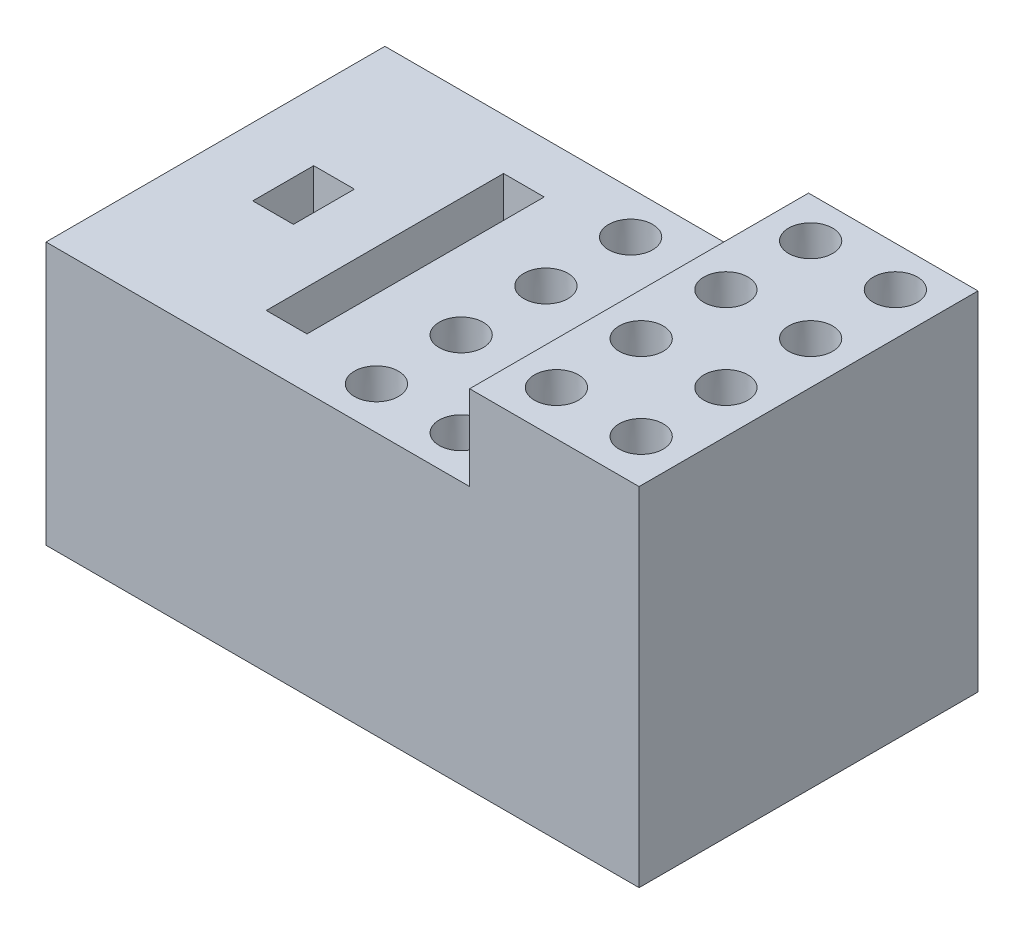
ISO-10303-21;
HEADER;
FILE_DESCRIPTION(('STEP AP214'),'2;1');
FILE_NAME('part.step','',(''),(''),'','','');
FILE_SCHEMA(('AUTOMOTIVE_DESIGN { 1 0 10303 214 1 1 1 1 }'));
ENDSEC;
DATA;
#1=APPLICATION_CONTEXT('core data for automotive mechanical design processes');
#2=APPLICATION_PROTOCOL_DEFINITION('international standard','automotive_design',2000,#1);
#3=PRODUCT_CONTEXT('',#1,'mechanical');
#4=PRODUCT('Part','Part','',(#3));
#5=PRODUCT_RELATED_PRODUCT_CATEGORY('part','',(#4));
#6=PRODUCT_DEFINITION_FORMATION('','',#4);
#7=PRODUCT_DEFINITION_CONTEXT('part definition',#1,'design');
#8=PRODUCT_DEFINITION('design','',#6,#7);
#9=PRODUCT_DEFINITION_SHAPE('','',#8);
#10=(LENGTH_UNIT() NAMED_UNIT(*) SI_UNIT(.MILLI.,.METRE.));
#11=(NAMED_UNIT(*) PLANE_ANGLE_UNIT() SI_UNIT($,.RADIAN.));
#12=(NAMED_UNIT(*) SI_UNIT($,.STERADIAN.) SOLID_ANGLE_UNIT());
#13=UNCERTAINTY_MEASURE_WITH_UNIT(LENGTH_MEASURE(1.E-05),#10,'distance_accuracy_value','');
#14=(GEOMETRIC_REPRESENTATION_CONTEXT(3) GLOBAL_UNCERTAINTY_ASSIGNED_CONTEXT((#13)) GLOBAL_UNIT_ASSIGNED_CONTEXT((#10,
#11,#12)) REPRESENTATION_CONTEXT('',''));
#15=CARTESIAN_POINT('',(0.,0.,0.));
#16=DIRECTION('',(0.,0.,1.));
#17=DIRECTION('',(1.,0.,0.));
#18=AXIS2_PLACEMENT_3D('',#15,#16,#17);
#19=CARTESIAN_POINT('',(0.,77.5,100.));
#20=DIRECTION('',(1.,0.,0.));
#21=DIRECTION('',(0.,0.,-1.));
#22=AXIS2_PLACEMENT_3D('',#19,#20,#21);
#23=PLANE('',#22);
#24=DIRECTION('',(0.,-1.,0.));
#25=VECTOR('',#24,1.);
#26=CARTESIAN_POINT('',(0.,77.5,0.));
#27=LINE('',#26,#25);
#28=CARTESIAN_POINT('',(0.,77.5,0.));
#29=VERTEX_POINT('',#28);
#30=CARTESIAN_POINT('',(0.,0.,0.));
#31=VERTEX_POINT('',#30);
#32=EDGE_CURVE('E360',#29,#31,#27,.T.);
#33=ORIENTED_EDGE('',*,*,#32,.T.);
#34=DIRECTION('',(0.,0.,-1.));
#35=VECTOR('',#34,1.);
#36=CARTESIAN_POINT('',(0.,0.,100.));
#37=LINE('',#36,#35);
#38=CARTESIAN_POINT('',(0.,0.,100.));
#39=VERTEX_POINT('',#38);
#40=EDGE_CURVE('E11',#39,#31,#37,.T.);
#41=ORIENTED_EDGE('',*,*,#40,.F.);
#42=DIRECTION('',(0.,-1.,0.));
#43=VECTOR('',#42,1.);
#44=CARTESIAN_POINT('',(0.,77.5,100.));
#45=LINE('',#44,#43);
#46=CARTESIAN_POINT('',(0.,77.5,100.));
#47=VERTEX_POINT('',#46);
#48=EDGE_CURVE('E361',#47,#39,#45,.T.);
#49=ORIENTED_EDGE('',*,*,#48,.F.);
#50=DIRECTION('',(0.,0.,-1.));
#51=VECTOR('',#50,1.);
#52=CARTESIAN_POINT('',(0.,77.5,100.));
#53=LINE('',#52,#51);
#54=EDGE_CURVE('E381',#47,#29,#53,.T.);
#55=ORIENTED_EDGE('',*,*,#54,.T.);
#56=EDGE_LOOP('',(#33,#41,#49,#55));
#57=FACE_BOUND('',#56,.T.);
#58=ADVANCED_FACE('F38',(#57),#23,.F.);
#59=CARTESIAN_POINT('',(0.,0.,100.));
#60=DIRECTION('',(0.,1.,0.));
#61=DIRECTION('',(0.,0.,1.));
#62=AXIS2_PLACEMENT_3D('',#59,#60,#61);
#63=PLANE('',#62);
#64=DIRECTION('',(1.,0.,0.));
#65=VECTOR('',#64,1.);
#66=CARTESIAN_POINT('',(0.,0.,0.));
#67=LINE('',#66,#65);
#68=CARTESIAN_POINT('',(175.,0.,0.));
#69=VERTEX_POINT('',#68);
#70=EDGE_CURVE('E385',#31,#69,#67,.T.);
#71=ORIENTED_EDGE('',*,*,#70,.T.);
#72=DIRECTION('',(0.,0.,-1.));
#73=VECTOR('',#72,1.);
#74=CARTESIAN_POINT('',(175.,0.,100.));
#75=LINE('',#74,#73);
#76=CARTESIAN_POINT('',(175.,0.,100.));
#77=VERTEX_POINT('',#76);
#78=EDGE_CURVE('E46',#77,#69,#75,.T.);
#79=ORIENTED_EDGE('',*,*,#78,.F.);
#80=DIRECTION('',(1.,0.,0.));
#81=VECTOR('',#80,1.);
#82=CARTESIAN_POINT('',(0.,0.,100.));
#83=LINE('',#82,#81);
#84=EDGE_CURVE('E365',#39,#77,#83,.T.);
#85=ORIENTED_EDGE('',*,*,#84,.F.);
#86=ORIENTED_EDGE('',*,*,#40,.T.);
#87=EDGE_LOOP('',(#71,#79,#85,#86));
#88=FACE_BOUND('',#87,.T.);
#89=ADVANCED_FACE('F442',(#88),#63,.F.);
#90=CARTESIAN_POINT('',(175.,0.,100.));
#91=DIRECTION('',(-1.,0.,0.));
#92=DIRECTION('',(0.,0.,1.));
#93=AXIS2_PLACEMENT_3D('',#90,#91,#92);
#94=PLANE('',#93);
#95=DIRECTION('',(0.,1.,0.));
#96=VECTOR('',#95,1.);
#97=CARTESIAN_POINT('',(175.,0.,0.));
#98=LINE('',#97,#96);
#99=CARTESIAN_POINT('',(175.,102.5,0.));
#100=VERTEX_POINT('',#99);
#101=EDGE_CURVE('E388',#69,#100,#98,.T.);
#102=ORIENTED_EDGE('',*,*,#101,.T.);
#103=DIRECTION('',(0.,0.,-1.));
#104=VECTOR('',#103,1.);
#105=CARTESIAN_POINT('',(175.,102.5,100.));
#106=LINE('',#105,#104);
#107=CARTESIAN_POINT('',(175.,102.5,100.));
#108=VERTEX_POINT('',#107);
#109=EDGE_CURVE('E410',#108,#100,#106,.T.);
#110=ORIENTED_EDGE('',*,*,#109,.F.);
#111=DIRECTION('',(0.,1.,0.));
#112=VECTOR('',#111,1.);
#113=CARTESIAN_POINT('',(175.,0.,100.));
#114=LINE('',#113,#112);
#115=EDGE_CURVE('E369',#77,#108,#114,.T.);
#116=ORIENTED_EDGE('',*,*,#115,.F.);
#117=ORIENTED_EDGE('',*,*,#78,.T.);
#118=EDGE_LOOP('',(#102,#110,#116,#117));
#119=FACE_BOUND('',#118,.T.);
#120=ADVANCED_FACE('F419',(#119),#94,.F.);
#121=CARTESIAN_POINT('',(175.,102.5,100.));
#122=DIRECTION('',(0.,-1.,0.));
#123=DIRECTION('',(0.,0.,-1.));
#124=AXIS2_PLACEMENT_3D('',#121,#122,#123);
#125=PLANE('',#124);
#126=CARTESIAN_POINT('',(137.500000000001,102.5,86.8844816832977));
#127=DIRECTION('',(0.,1.,0.));
#128=DIRECTION('',(0.,0.,1.));
#129=AXIS2_PLACEMENT_3D('',#126,#127,#128);
#130=CIRCLE('',#129,6.50000000000002);
#131=CARTESIAN_POINT('',(137.500000000001,102.5,93.3844816832978));
#132=VERTEX_POINT('',#131);
#133=EDGE_CURVE('E208',#132,#132,#130,.T.);
#134=ORIENTED_EDGE('',*,*,#133,.F.);
#135=EDGE_LOOP('',(#134));
#136=FACE_BOUND('',#135,.T.);
#137=CARTESIAN_POINT('',(137.500000000001,102.5,61.8844816832977));
#138=DIRECTION('',(0.,1.,0.));
#139=DIRECTION('',(0.,0.,1.));
#140=AXIS2_PLACEMENT_3D('',#137,#138,#139);
#141=CIRCLE('',#140,6.50000000000001);
#142=CARTESIAN_POINT('',(137.500000000001,102.5,68.3844816832977));
#143=VERTEX_POINT('',#142);
#144=EDGE_CURVE('E275',#143,#143,#141,.T.);
#145=ORIENTED_EDGE('',*,*,#144,.F.);
#146=EDGE_LOOP('',(#145));
#147=FACE_BOUND('',#146,.T.);
#148=CARTESIAN_POINT('',(137.5,102.5,36.8844816832977));
#149=DIRECTION('',(0.,1.,0.));
#150=DIRECTION('',(0.,0.,1.));
#151=AXIS2_PLACEMENT_3D('',#148,#149,#150);
#152=CIRCLE('',#151,6.50000000000002);
#153=CARTESIAN_POINT('',(137.5,102.5,43.3844816832977));
#154=VERTEX_POINT('',#153);
#155=EDGE_CURVE('E267',#154,#154,#152,.T.);
#156=ORIENTED_EDGE('',*,*,#155,.F.);
#157=EDGE_LOOP('',(#156));
#158=FACE_BOUND('',#157,.T.);
#159=CARTESIAN_POINT('',(162.500000000001,102.5,86.8844816832977));
#160=DIRECTION('',(0.,1.,0.));
#161=DIRECTION('',(0.,0.,1.));
#162=AXIS2_PLACEMENT_3D('',#159,#160,#161);
#163=CIRCLE('',#162,6.50000000000002);
#164=CARTESIAN_POINT('',(162.500000000001,102.5,93.3844816832978));
#165=VERTEX_POINT('',#164);
#166=EDGE_CURVE('E259',#165,#165,#163,.T.);
#167=ORIENTED_EDGE('',*,*,#166,.F.);
#168=EDGE_LOOP('',(#167));
#169=FACE_BOUND('',#168,.T.);
#170=CARTESIAN_POINT('',(162.500000000001,102.5,61.8844816832977));
#171=DIRECTION('',(0.,1.,0.));
#172=DIRECTION('',(0.,0.,1.));
#173=AXIS2_PLACEMENT_3D('',#170,#171,#172);
#174=CIRCLE('',#173,6.49999999999998);
#175=CARTESIAN_POINT('',(162.500000000001,102.5,68.3844816832977));
#176=VERTEX_POINT('',#175);
#177=EDGE_CURVE('E251',#176,#176,#174,.T.);
#178=ORIENTED_EDGE('',*,*,#177,.F.);
#179=EDGE_LOOP('',(#178));
#180=FACE_BOUND('',#179,.T.);
#181=CARTESIAN_POINT('',(162.5,102.5,36.8844816832977));
#182=DIRECTION('',(0.,1.,0.));
#183=DIRECTION('',(0.,0.,1.));
#184=AXIS2_PLACEMENT_3D('',#181,#182,#183);
#185=CIRCLE('',#184,6.49999999999998);
#186=CARTESIAN_POINT('',(162.5,102.5,43.3844816832977));
#187=VERTEX_POINT('',#186);
#188=EDGE_CURVE('E243',#187,#187,#185,.T.);
#189=ORIENTED_EDGE('',*,*,#188,.F.);
#190=EDGE_LOOP('',(#189));
#191=FACE_BOUND('',#190,.T.);
#192=CARTESIAN_POINT('',(162.5,102.5,11.8844816832977));
#193=DIRECTION('',(0.,1.,0.));
#194=DIRECTION('',(0.,0.,1.));
#195=AXIS2_PLACEMENT_3D('',#192,#193,#194);
#196=CIRCLE('',#195,6.50000000000002);
#197=CARTESIAN_POINT('',(162.5,102.5,18.3844816832977));
#198=VERTEX_POINT('',#197);
#199=EDGE_CURVE('E233',#198,#198,#196,.T.);
#200=ORIENTED_EDGE('',*,*,#199,.F.);
#201=EDGE_LOOP('',(#200));
#202=FACE_BOUND('',#201,.T.);
#203=CARTESIAN_POINT('',(137.5,102.5,11.8844816832977));
#204=DIRECTION('',(0.,1.,0.));
#205=DIRECTION('',(0.,0.,1.));
#206=AXIS2_PLACEMENT_3D('',#203,#204,#205);
#207=CIRCLE('',#206,6.50000000000002);
#208=CARTESIAN_POINT('',(137.5,102.5,18.3844816832977));
#209=VERTEX_POINT('',#208);
#210=EDGE_CURVE('E242',#209,#209,#207,.T.);
#211=ORIENTED_EDGE('',*,*,#210,.F.);
#212=EDGE_LOOP('',(#211));
#213=FACE_BOUND('',#212,.T.);
#214=DIRECTION('',(-1.,0.,0.));
#215=VECTOR('',#214,1.);
#216=CARTESIAN_POINT('',(175.,102.5,0.));
#217=LINE('',#216,#215);
#218=CARTESIAN_POINT('',(125.,102.5,0.));
#219=VERTEX_POINT('',#218);
#220=EDGE_CURVE('E391',#100,#219,#217,.T.);
#221=ORIENTED_EDGE('',*,*,#220,.T.);
#222=DIRECTION('',(0.,0.,-1.));
#223=VECTOR('',#222,1.);
#224=CARTESIAN_POINT('',(125.,102.5,100.));
#225=LINE('',#224,#223);
#226=CARTESIAN_POINT('',(125.,102.5,100.));
#227=VERTEX_POINT('',#226);
#228=EDGE_CURVE('E406',#227,#219,#225,.T.);
#229=ORIENTED_EDGE('',*,*,#228,.F.);
#230=DIRECTION('',(-1.,0.,0.));
#231=VECTOR('',#230,1.);
#232=CARTESIAN_POINT('',(175.,102.5,100.));
#233=LINE('',#232,#231);
#234=EDGE_CURVE('E372',#108,#227,#233,.T.);
#235=ORIENTED_EDGE('',*,*,#234,.F.);
#236=ORIENTED_EDGE('',*,*,#109,.T.);
#237=EDGE_LOOP('',(#221,#229,#235,#236));
#238=FACE_BOUND('',#237,.T.);
#239=ADVANCED_FACE('F430',(#136,#147,#158,#169,#180,#191,#202,#213,#238),#125,.F.);
#240=CARTESIAN_POINT('',(125.,102.5,100.));
#241=DIRECTION('',(1.,0.,0.));
#242=DIRECTION('',(0.,0.,-1.));
#243=AXIS2_PLACEMENT_3D('',#240,#241,#242);
#244=PLANE('',#243);
#245=DIRECTION('',(0.,-1.,0.));
#246=VECTOR('',#245,1.);
#247=CARTESIAN_POINT('',(125.,102.5,0.));
#248=LINE('',#247,#246);
#249=CARTESIAN_POINT('',(125.,77.5,0.));
#250=VERTEX_POINT('',#249);
#251=EDGE_CURVE('E394',#219,#250,#248,.T.);
#252=ORIENTED_EDGE('',*,*,#251,.T.);
#253=DIRECTION('',(0.,0.,-1.));
#254=VECTOR('',#253,1.);
#255=CARTESIAN_POINT('',(125.,77.5,100.));
#256=LINE('',#255,#254);
#257=CARTESIAN_POINT('',(125.,77.5,100.));
#258=VERTEX_POINT('',#257);
#259=EDGE_CURVE('E402',#258,#250,#256,.T.);
#260=ORIENTED_EDGE('',*,*,#259,.F.);
#261=DIRECTION('',(0.,-1.,0.));
#262=VECTOR('',#261,1.);
#263=CARTESIAN_POINT('',(125.,102.5,100.));
#264=LINE('',#263,#262);
#265=EDGE_CURVE('E375',#227,#258,#264,.T.);
#266=ORIENTED_EDGE('',*,*,#265,.F.);
#267=ORIENTED_EDGE('',*,*,#228,.T.);
#268=EDGE_LOOP('',(#252,#260,#266,#267));
#269=FACE_BOUND('',#268,.T.);
#270=ADVANCED_FACE('F434',(#269),#244,.F.);
#271=CARTESIAN_POINT('',(125.,77.5,100.));
#272=DIRECTION('',(0.,-1.,0.));
#273=DIRECTION('',(1.,0.,0.));
#274=AXIS2_PLACEMENT_3D('',#271,#272,#273);
#275=PLANE('',#274);
#276=DIRECTION('',(1.,0.,0.));
#277=VECTOR('',#276,1.);
#278=CARTESIAN_POINT('',(32.,77.5,59.));
#279=LINE('',#278,#277);
#280=CARTESIAN_POINT('',(20.,77.5,59.));
#281=VERTEX_POINT('',#280);
#282=CARTESIAN_POINT('',(32.,77.5,59.));
#283=VERTEX_POINT('',#282);
#284=EDGE_CURVE('E155',#281,#283,#279,.T.);
#285=ORIENTED_EDGE('',*,*,#284,.F.);
#286=DIRECTION('',(0.,0.,1.));
#287=VECTOR('',#286,1.);
#288=CARTESIAN_POINT('',(20.,77.5,59.));
#289=LINE('',#288,#287);
#290=CARTESIAN_POINT('',(20.,77.5,41.));
#291=VERTEX_POINT('',#290);
#292=EDGE_CURVE('E53',#291,#281,#289,.T.);
#293=ORIENTED_EDGE('',*,*,#292,.F.);
#294=DIRECTION('',(-1.,0.,0.));
#295=VECTOR('',#294,1.);
#296=CARTESIAN_POINT('',(32.,77.5,41.));
#297=LINE('',#296,#295);
#298=CARTESIAN_POINT('',(32.,77.5,41.));
#299=VERTEX_POINT('',#298);
#300=EDGE_CURVE('E163',#299,#291,#297,.T.);
#301=ORIENTED_EDGE('',*,*,#300,.F.);
#302=DIRECTION('',(0.,0.,-1.));
#303=VECTOR('',#302,1.);
#304=CARTESIAN_POINT('',(32.,77.5,59.));
#305=LINE('',#304,#303);
#306=EDGE_CURVE('E143',#283,#299,#305,.T.);
#307=ORIENTED_EDGE('',*,*,#306,.F.);
#308=EDGE_LOOP('',(#285,#293,#301,#307));
#309=FACE_BOUND('',#308,.T.);
#310=DIRECTION('',(1.,0.,0.));
#311=VECTOR('',#310,1.);
#312=CARTESIAN_POINT('',(62.,77.5,85.));
#313=LINE('',#312,#311);
#314=CARTESIAN_POINT('',(50.,77.5,85.));
#315=VERTEX_POINT('',#314);
#316=CARTESIAN_POINT('',(62.,77.5,85.));
#317=VERTEX_POINT('',#316);
#318=EDGE_CURVE('E192',#315,#317,#313,.T.);
#319=ORIENTED_EDGE('',*,*,#318,.F.);
#320=DIRECTION('',(0.,0.,1.));
#321=VECTOR('',#320,1.);
#322=CARTESIAN_POINT('',(50.,77.5,85.));
#323=LINE('',#322,#321);
#324=CARTESIAN_POINT('',(50.,77.5,15.));
#325=VERTEX_POINT('',#324);
#326=EDGE_CURVE('E61',#325,#315,#323,.T.);
#327=ORIENTED_EDGE('',*,*,#326,.F.);
#328=DIRECTION('',(-1.,0.,0.));
#329=VECTOR('',#328,1.);
#330=CARTESIAN_POINT('',(62.,77.5,15.));
#331=LINE('',#330,#329);
#332=CARTESIAN_POINT('',(62.,77.5,15.));
#333=VERTEX_POINT('',#332);
#334=EDGE_CURVE('E200',#333,#325,#331,.T.);
#335=ORIENTED_EDGE('',*,*,#334,.F.);
#336=DIRECTION('',(0.,0.,-1.));
#337=VECTOR('',#336,1.);
#338=CARTESIAN_POINT('',(62.,77.5,85.));
#339=LINE('',#338,#337);
#340=EDGE_CURVE('E196',#317,#333,#339,.T.);
#341=ORIENTED_EDGE('',*,*,#340,.F.);
#342=EDGE_LOOP('',(#319,#327,#335,#341));
#343=FACE_BOUND('',#342,.T.);
#344=CARTESIAN_POINT('',(85.0000000000008,77.5,87.5));
#345=DIRECTION('',(0.,1.,0.));
#346=DIRECTION('',(0.,0.,1.));
#347=AXIS2_PLACEMENT_3D('',#344,#345,#346);
#348=CIRCLE('',#347,6.5);
#349=CARTESIAN_POINT('',(85.0000000000008,77.5,94.));
#350=VERTEX_POINT('',#349);
#351=EDGE_CURVE('E296',#350,#350,#348,.T.);
#352=ORIENTED_EDGE('',*,*,#351,.F.);
#353=EDGE_LOOP('',(#352));
#354=FACE_BOUND('',#353,.T.);
#355=CARTESIAN_POINT('',(85.0000000000005,77.5,62.5));
#356=DIRECTION('',(0.,1.,0.));
#357=DIRECTION('',(0.,0.,1.));
#358=AXIS2_PLACEMENT_3D('',#355,#356,#357);
#359=CIRCLE('',#358,6.5);
#360=CARTESIAN_POINT('',(85.0000000000005,77.5,69.));
#361=VERTEX_POINT('',#360);
#362=EDGE_CURVE('E339',#361,#361,#359,.T.);
#363=ORIENTED_EDGE('',*,*,#362,.F.);
#364=EDGE_LOOP('',(#363));
#365=FACE_BOUND('',#364,.T.);
#366=CARTESIAN_POINT('',(85.0000000000003,77.5,37.5));
#367=DIRECTION('',(0.,1.,0.));
#368=DIRECTION('',(0.,0.,1.));
#369=AXIS2_PLACEMENT_3D('',#366,#367,#368);
#370=CIRCLE('',#369,6.5);
#371=CARTESIAN_POINT('',(85.0000000000003,77.5,44.));
#372=VERTEX_POINT('',#371);
#373=EDGE_CURVE('E331',#372,#372,#370,.T.);
#374=ORIENTED_EDGE('',*,*,#373,.F.);
#375=EDGE_LOOP('',(#374));
#376=FACE_BOUND('',#375,.T.);
#377=CARTESIAN_POINT('',(110.000000000001,77.5,87.5));
#378=DIRECTION('',(0.,1.,0.));
#379=DIRECTION('',(0.,0.,1.));
#380=AXIS2_PLACEMENT_3D('',#377,#378,#379);
#381=CIRCLE('',#380,6.5);
#382=CARTESIAN_POINT('',(110.000000000001,77.5,94.));
#383=VERTEX_POINT('',#382);
#384=EDGE_CURVE('E323',#383,#383,#381,.T.);
#385=ORIENTED_EDGE('',*,*,#384,.F.);
#386=EDGE_LOOP('',(#385));
#387=FACE_BOUND('',#386,.T.);
#388=CARTESIAN_POINT('',(110.000000000001,77.5,62.5));
#389=DIRECTION('',(0.,1.,0.));
#390=DIRECTION('',(0.,0.,1.));
#391=AXIS2_PLACEMENT_3D('',#388,#389,#390);
#392=CIRCLE('',#391,6.5);
#393=CARTESIAN_POINT('',(110.000000000001,77.5,69.));
#394=VERTEX_POINT('',#393);
#395=EDGE_CURVE('E315',#394,#394,#392,.T.);
#396=ORIENTED_EDGE('',*,*,#395,.F.);
#397=EDGE_LOOP('',(#396));
#398=FACE_BOUND('',#397,.T.);
#399=CARTESIAN_POINT('',(110.,77.5,37.5));
#400=DIRECTION('',(0.,1.,0.));
#401=DIRECTION('',(0.,0.,1.));
#402=AXIS2_PLACEMENT_3D('',#399,#400,#401);
#403=CIRCLE('',#402,6.5);
#404=CARTESIAN_POINT('',(110.,77.5,44.));
#405=VERTEX_POINT('',#404);
#406=EDGE_CURVE('E307',#405,#405,#403,.T.);
#407=ORIENTED_EDGE('',*,*,#406,.F.);
#408=EDGE_LOOP('',(#407));
#409=FACE_BOUND('',#408,.T.);
#410=CARTESIAN_POINT('',(110.,77.5,12.5));
#411=DIRECTION('',(0.,1.,0.));
#412=DIRECTION('',(0.,0.,1.));
#413=AXIS2_PLACEMENT_3D('',#410,#411,#412);
#414=CIRCLE('',#413,6.5);
#415=CARTESIAN_POINT('',(110.,77.5,19.));
#416=VERTEX_POINT('',#415);
#417=EDGE_CURVE('E297',#416,#416,#414,.T.);
#418=ORIENTED_EDGE('',*,*,#417,.F.);
#419=EDGE_LOOP('',(#418));
#420=FACE_BOUND('',#419,.T.);
#421=CARTESIAN_POINT('',(85.,77.5,12.5));
#422=DIRECTION('',(0.,1.,0.));
#423=DIRECTION('',(0.,0.,1.));
#424=AXIS2_PLACEMENT_3D('',#421,#422,#423);
#425=CIRCLE('',#424,6.5);
#426=CARTESIAN_POINT('',(85.,77.5,19.));
#427=VERTEX_POINT('',#426);
#428=EDGE_CURVE('E306',#427,#427,#425,.T.);
#429=ORIENTED_EDGE('',*,*,#428,.F.);
#430=EDGE_LOOP('',(#429));
#431=FACE_BOUND('',#430,.T.);
#432=DIRECTION('',(-1.,0.,0.));
#433=VECTOR('',#432,1.);
#434=CARTESIAN_POINT('',(125.,77.5,0.));
#435=LINE('',#434,#433);
#436=EDGE_CURVE('E366',#250,#29,#435,.T.);
#437=ORIENTED_EDGE('',*,*,#436,.T.);
#438=ORIENTED_EDGE('',*,*,#54,.F.);
#439=DIRECTION('',(-1.,0.,0.));
#440=VECTOR('',#439,1.);
#441=CARTESIAN_POINT('',(125.,77.5,100.));
#442=LINE('',#441,#440);
#443=EDGE_CURVE('E378',#258,#47,#442,.T.);
#444=ORIENTED_EDGE('',*,*,#443,.F.);
#445=ORIENTED_EDGE('',*,*,#259,.T.);
#446=EDGE_LOOP('',(#437,#438,#444,#445));
#447=FACE_BOUND('',#446,.T.);
#448=ADVANCED_FACE('F160',(#309,#343,#354,#365,#376,#387,#398,#409,#420,#431,#447),#275,.F.);
#449=CARTESIAN_POINT('',(0.,0.,100.));
#450=DIRECTION('',(0.,0.,1.));
#451=DIRECTION('',(1.,0.,0.));
#452=AXIS2_PLACEMENT_3D('',#449,#450,#451);
#453=PLANE('',#452);
#454=ORIENTED_EDGE('',*,*,#48,.T.);
#455=ORIENTED_EDGE('',*,*,#84,.T.);
#456=ORIENTED_EDGE('',*,*,#115,.T.);
#457=ORIENTED_EDGE('',*,*,#234,.T.);
#458=ORIENTED_EDGE('',*,*,#265,.T.);
#459=ORIENTED_EDGE('',*,*,#443,.T.);
#460=EDGE_LOOP('',(#454,#455,#456,#457,#458,#459));
#461=FACE_BOUND('',#460,.T.);
#462=ADVANCED_FACE('F438',(#461),#453,.T.);
#463=CARTESIAN_POINT('',(0.,0.,0.));
#464=DIRECTION('',(0.,0.,1.));
#465=DIRECTION('',(1.,0.,0.));
#466=AXIS2_PLACEMENT_3D('',#463,#464,#465);
#467=PLANE('',#466);
#468=ORIENTED_EDGE('',*,*,#32,.F.);
#469=ORIENTED_EDGE('',*,*,#436,.F.);
#470=ORIENTED_EDGE('',*,*,#251,.F.);
#471=ORIENTED_EDGE('',*,*,#220,.F.);
#472=ORIENTED_EDGE('',*,*,#101,.F.);
#473=ORIENTED_EDGE('',*,*,#70,.F.);
#474=EDGE_LOOP('',(#468,#469,#470,#471,#472,#473));
#475=FACE_BOUND('',#474,.T.);
#476=ADVANCED_FACE('F425',(#475),#467,.F.);
#477=CARTESIAN_POINT('',(85.,77.5,12.5));
#478=DIRECTION('',(0.,1.,0.));
#479=DIRECTION('',(0.,0.,1.));
#480=AXIS2_PLACEMENT_3D('',#477,#478,#479);
#481=CONICAL_SURFACE('',#480,6.5,0.0226892802759263);
#482=CARTESIAN_POINT('',(85.,2.49999999999999,12.5));
#483=DIRECTION('',(0.,1.,0.));
#484=DIRECTION('',(0.,0.,1.));
#485=AXIS2_PLACEMENT_3D('',#482,#483,#484);
#486=CIRCLE('',#485,4.79801190617317);
#487=CARTESIAN_POINT('',(85.,2.49999999999999,17.2980119061732));
#488=VERTEX_POINT('',#487);
#489=EDGE_CURVE('E356',#488,#488,#486,.T.);
#490=ORIENTED_EDGE('',*,*,#489,.F.);
#491=EDGE_LOOP('',(#490));
#492=FACE_BOUND('',#491,.T.);
#493=ORIENTED_EDGE('',*,*,#428,.T.);
#494=EDGE_LOOP('',(#493));
#495=FACE_BOUND('',#494,.T.);
#496=ADVANCED_FACE('F556',(#492,#495),#481,.F.);
#497=CARTESIAN_POINT('',(85.,2.49999999999999,12.5));
#498=DIRECTION('',(0.,1.,0.));
#499=DIRECTION('',(0.,0.,1.));
#500=AXIS2_PLACEMENT_3D('',#497,#498,#499);
#501=PLANE('',#500);
#502=ORIENTED_EDGE('',*,*,#489,.T.);
#503=EDGE_LOOP('',(#502));
#504=FACE_BOUND('',#503,.T.);
#505=ADVANCED_FACE('F510',(#504),#501,.T.);
#506=CARTESIAN_POINT('',(110.,77.5,12.5));
#507=DIRECTION('',(0.,1.,0.));
#508=DIRECTION('',(0.,0.,1.));
#509=AXIS2_PLACEMENT_3D('',#506,#507,#508);
#510=CONICAL_SURFACE('',#509,6.5,0.0226892802759263);
#511=CARTESIAN_POINT('',(110.,2.49999999999999,12.5));
#512=DIRECTION('',(0.,1.,0.));
#513=DIRECTION('',(0.,0.,1.));
#514=AXIS2_PLACEMENT_3D('',#511,#512,#513);
#515=CIRCLE('',#514,4.79801190617317);
#516=CARTESIAN_POINT('',(110.,2.49999999999999,17.2980119061732));
#517=VERTEX_POINT('',#516);
#518=EDGE_CURVE('E301',#517,#517,#515,.T.);
#519=ORIENTED_EDGE('',*,*,#518,.F.);
#520=EDGE_LOOP('',(#519));
#521=FACE_BOUND('',#520,.T.);
#522=ORIENTED_EDGE('',*,*,#417,.T.);
#523=EDGE_LOOP('',(#522));
#524=FACE_BOUND('',#523,.T.);
#525=ADVANCED_FACE('F506',(#521,#524),#510,.F.);
#526=CARTESIAN_POINT('',(110.,2.49999999999999,12.5));
#527=DIRECTION('',(0.,1.,0.));
#528=DIRECTION('',(0.,0.,1.));
#529=AXIS2_PLACEMENT_3D('',#526,#527,#528);
#530=PLANE('',#529);
#531=ORIENTED_EDGE('',*,*,#518,.T.);
#532=EDGE_LOOP('',(#531));
#533=FACE_BOUND('',#532,.T.);
#534=ADVANCED_FACE('F502',(#533),#530,.T.);
#535=CARTESIAN_POINT('',(110.,77.5,37.5));
#536=DIRECTION('',(0.,1.,0.));
#537=DIRECTION('',(0.,0.,1.));
#538=AXIS2_PLACEMENT_3D('',#535,#536,#537);
#539=CONICAL_SURFACE('',#538,6.5,0.0226892802759263);
#540=CARTESIAN_POINT('',(110.,2.49999999999999,37.5));
#541=DIRECTION('',(0.,1.,0.));
#542=DIRECTION('',(0.,0.,1.));
#543=AXIS2_PLACEMENT_3D('',#540,#541,#542);
#544=CIRCLE('',#543,4.79801190617317);
#545=CARTESIAN_POINT('',(110.,2.49999999999999,42.2980119061732));
#546=VERTEX_POINT('',#545);
#547=EDGE_CURVE('E302',#546,#546,#544,.T.);
#548=ORIENTED_EDGE('',*,*,#547,.F.);
#549=EDGE_LOOP('',(#548));
#550=FACE_BOUND('',#549,.T.);
#551=ORIENTED_EDGE('',*,*,#406,.T.);
#552=EDGE_LOOP('',(#551));
#553=FACE_BOUND('',#552,.T.);
#554=ADVANCED_FACE('F505',(#550,#553),#539,.F.);
#555=CARTESIAN_POINT('',(110.,2.49999999999999,37.5));
#556=DIRECTION('',(0.,1.,0.));
#557=DIRECTION('',(0.,0.,1.));
#558=AXIS2_PLACEMENT_3D('',#555,#556,#557);
#559=PLANE('',#558);
#560=ORIENTED_EDGE('',*,*,#547,.T.);
#561=EDGE_LOOP('',(#560));
#562=FACE_BOUND('',#561,.T.);
#563=ADVANCED_FACE('F512',(#562),#559,.T.);
#564=CARTESIAN_POINT('',(110.000000000001,77.5,62.5));
#565=DIRECTION('',(0.,1.,0.));
#566=DIRECTION('',(0.,0.,1.));
#567=AXIS2_PLACEMENT_3D('',#564,#565,#566);
#568=CONICAL_SURFACE('',#567,6.5,0.0226892802759263);
#569=CARTESIAN_POINT('',(110.000000000001,2.49999999999999,62.5));
#570=DIRECTION('',(0.,1.,0.));
#571=DIRECTION('',(0.,0.,1.));
#572=AXIS2_PLACEMENT_3D('',#569,#570,#571);
#573=CIRCLE('',#572,4.79801190617317);
#574=CARTESIAN_POINT('',(110.000000000001,2.49999999999999,67.2980119061732));
#575=VERTEX_POINT('',#574);
#576=EDGE_CURVE('E311',#575,#575,#573,.T.);
#577=ORIENTED_EDGE('',*,*,#576,.F.);
#578=EDGE_LOOP('',(#577));
#579=FACE_BOUND('',#578,.T.);
#580=ORIENTED_EDGE('',*,*,#395,.T.);
#581=EDGE_LOOP('',(#580));
#582=FACE_BOUND('',#581,.T.);
#583=ADVANCED_FACE('F515',(#579,#582),#568,.F.);
#584=CARTESIAN_POINT('',(110.000000000001,2.49999999999999,62.5));
#585=DIRECTION('',(0.,1.,0.));
#586=DIRECTION('',(0.,0.,1.));
#587=AXIS2_PLACEMENT_3D('',#584,#585,#586);
#588=PLANE('',#587);
#589=ORIENTED_EDGE('',*,*,#576,.T.);
#590=EDGE_LOOP('',(#589));
#591=FACE_BOUND('',#590,.T.);
#592=ADVANCED_FACE('F520',(#591),#588,.T.);
#593=CARTESIAN_POINT('',(110.000000000001,77.5,87.5));
#594=DIRECTION('',(0.,1.,0.));
#595=DIRECTION('',(0.,0.,1.));
#596=AXIS2_PLACEMENT_3D('',#593,#594,#595);
#597=CONICAL_SURFACE('',#596,6.5,0.0226892802759263);
#598=CARTESIAN_POINT('',(110.000000000001,2.49999999999999,87.5));
#599=DIRECTION('',(0.,1.,0.));
#600=DIRECTION('',(0.,0.,1.));
#601=AXIS2_PLACEMENT_3D('',#598,#599,#600);
#602=CIRCLE('',#601,4.79801190617317);
#603=CARTESIAN_POINT('',(110.000000000001,2.49999999999999,92.2980119061732));
#604=VERTEX_POINT('',#603);
#605=EDGE_CURVE('E319',#604,#604,#602,.T.);
#606=ORIENTED_EDGE('',*,*,#605,.F.);
#607=EDGE_LOOP('',(#606));
#608=FACE_BOUND('',#607,.T.);
#609=ORIENTED_EDGE('',*,*,#384,.T.);
#610=EDGE_LOOP('',(#609));
#611=FACE_BOUND('',#610,.T.);
#612=ADVANCED_FACE('F523',(#608,#611),#597,.F.);
#613=CARTESIAN_POINT('',(110.000000000001,2.49999999999999,87.5));
#614=DIRECTION('',(0.,1.,0.));
#615=DIRECTION('',(0.,0.,1.));
#616=AXIS2_PLACEMENT_3D('',#613,#614,#615);
#617=PLANE('',#616);
#618=ORIENTED_EDGE('',*,*,#605,.T.);
#619=EDGE_LOOP('',(#618));
#620=FACE_BOUND('',#619,.T.);
#621=ADVANCED_FACE('F528',(#620),#617,.T.);
#622=CARTESIAN_POINT('',(85.0000000000003,77.5,37.5));
#623=DIRECTION('',(0.,1.,0.));
#624=DIRECTION('',(0.,0.,1.));
#625=AXIS2_PLACEMENT_3D('',#622,#623,#624);
#626=CONICAL_SURFACE('',#625,6.5,0.0226892802759263);
#627=CARTESIAN_POINT('',(85.0000000000003,2.49999999999999,37.5));
#628=DIRECTION('',(0.,1.,0.));
#629=DIRECTION('',(0.,0.,1.));
#630=AXIS2_PLACEMENT_3D('',#627,#628,#629);
#631=CIRCLE('',#630,4.79801190617317);
#632=CARTESIAN_POINT('',(85.0000000000003,2.49999999999999,42.2980119061732));
#633=VERTEX_POINT('',#632);
#634=EDGE_CURVE('E327',#633,#633,#631,.T.);
#635=ORIENTED_EDGE('',*,*,#634,.F.);
#636=EDGE_LOOP('',(#635));
#637=FACE_BOUND('',#636,.T.);
#638=ORIENTED_EDGE('',*,*,#373,.T.);
#639=EDGE_LOOP('',(#638));
#640=FACE_BOUND('',#639,.T.);
#641=ADVANCED_FACE('F531',(#637,#640),#626,.F.);
#642=CARTESIAN_POINT('',(85.0000000000003,2.49999999999999,37.5));
#643=DIRECTION('',(0.,1.,0.));
#644=DIRECTION('',(0.,0.,1.));
#645=AXIS2_PLACEMENT_3D('',#642,#643,#644);
#646=PLANE('',#645);
#647=ORIENTED_EDGE('',*,*,#634,.T.);
#648=EDGE_LOOP('',(#647));
#649=FACE_BOUND('',#648,.T.);
#650=ADVANCED_FACE('F536',(#649),#646,.T.);
#651=CARTESIAN_POINT('',(85.0000000000005,77.5,62.5));
#652=DIRECTION('',(0.,1.,0.));
#653=DIRECTION('',(0.,0.,1.));
#654=AXIS2_PLACEMENT_3D('',#651,#652,#653);
#655=CONICAL_SURFACE('',#654,6.5,0.0226892802759263);
#656=CARTESIAN_POINT('',(85.0000000000005,2.49999999999999,62.5));
#657=DIRECTION('',(0.,1.,0.));
#658=DIRECTION('',(0.,0.,1.));
#659=AXIS2_PLACEMENT_3D('',#656,#657,#658);
#660=CIRCLE('',#659,4.79801190617317);
#661=CARTESIAN_POINT('',(85.0000000000005,2.49999999999999,67.2980119061732));
#662=VERTEX_POINT('',#661);
#663=EDGE_CURVE('E335',#662,#662,#660,.T.);
#664=ORIENTED_EDGE('',*,*,#663,.F.);
#665=EDGE_LOOP('',(#664));
#666=FACE_BOUND('',#665,.T.);
#667=ORIENTED_EDGE('',*,*,#362,.T.);
#668=EDGE_LOOP('',(#667));
#669=FACE_BOUND('',#668,.T.);
#670=ADVANCED_FACE('F539',(#666,#669),#655,.F.);
#671=CARTESIAN_POINT('',(85.0000000000005,2.49999999999999,62.5));
#672=DIRECTION('',(0.,1.,0.));
#673=DIRECTION('',(0.,0.,1.));
#674=AXIS2_PLACEMENT_3D('',#671,#672,#673);
#675=PLANE('',#674);
#676=ORIENTED_EDGE('',*,*,#663,.T.);
#677=EDGE_LOOP('',(#676));
#678=FACE_BOUND('',#677,.T.);
#679=ADVANCED_FACE('F544',(#678),#675,.T.);
#680=CARTESIAN_POINT('',(85.0000000000008,77.5,87.5));
#681=DIRECTION('',(0.,1.,0.));
#682=DIRECTION('',(0.,0.,1.));
#683=AXIS2_PLACEMENT_3D('',#680,#681,#682);
#684=CONICAL_SURFACE('',#683,6.5,0.0226892802759263);
#685=CARTESIAN_POINT('',(85.0000000000008,2.49999999999999,87.5));
#686=DIRECTION('',(0.,1.,0.));
#687=DIRECTION('',(0.,0.,1.));
#688=AXIS2_PLACEMENT_3D('',#685,#686,#687);
#689=CIRCLE('',#688,4.79801190617317);
#690=CARTESIAN_POINT('',(85.0000000000008,2.49999999999999,92.2980119061732));
#691=VERTEX_POINT('',#690);
#692=EDGE_CURVE('E343',#691,#691,#689,.T.);
#693=ORIENTED_EDGE('',*,*,#692,.F.);
#694=EDGE_LOOP('',(#693));
#695=FACE_BOUND('',#694,.T.);
#696=ORIENTED_EDGE('',*,*,#351,.T.);
#697=EDGE_LOOP('',(#696));
#698=FACE_BOUND('',#697,.T.);
#699=ADVANCED_FACE('F496',(#695,#698),#684,.F.);
#700=CARTESIAN_POINT('',(85.0000000000008,2.49999999999999,87.5));
#701=DIRECTION('',(0.,1.,0.));
#702=DIRECTION('',(0.,0.,1.));
#703=AXIS2_PLACEMENT_3D('',#700,#701,#702);
#704=PLANE('',#703);
#705=ORIENTED_EDGE('',*,*,#692,.T.);
#706=EDGE_LOOP('',(#705));
#707=FACE_BOUND('',#706,.T.);
#708=ADVANCED_FACE('F486',(#707),#704,.T.);
#709=CARTESIAN_POINT('',(137.5,102.5,11.8844816832977));
#710=DIRECTION('',(0.,1.,0.));
#711=DIRECTION('',(0.,0.,1.));
#712=AXIS2_PLACEMENT_3D('',#709,#710,#711);
#713=CONICAL_SURFACE('',#712,6.50000000000002,0.0174532925199433);
#714=CARTESIAN_POINT('',(137.5,2.49999999999999,11.8844816832977));
#715=DIRECTION('',(0.,1.,0.));
#716=DIRECTION('',(0.,0.,1.));
#717=AXIS2_PLACEMENT_3D('',#714,#715,#716);
#718=CIRCLE('',#717,4.75449350717825);
#719=CARTESIAN_POINT('',(137.5,2.49999999999999,16.638975190476));
#720=VERTEX_POINT('',#719);
#721=EDGE_CURVE('E292',#720,#720,#718,.T.);
#722=ORIENTED_EDGE('',*,*,#721,.F.);
#723=EDGE_LOOP('',(#722));
#724=FACE_BOUND('',#723,.T.);
#725=ORIENTED_EDGE('',*,*,#210,.T.);
#726=EDGE_LOOP('',(#725));
#727=FACE_BOUND('',#726,.T.);
#728=ADVANCED_FACE('F483',(#724,#727),#713,.F.);
#729=CARTESIAN_POINT('',(137.5,2.49999999999999,11.8844816832977));
#730=DIRECTION('',(0.,1.,0.));
#731=DIRECTION('',(0.,0.,1.));
#732=AXIS2_PLACEMENT_3D('',#729,#730,#731);
#733=PLANE('',#732);
#734=ORIENTED_EDGE('',*,*,#721,.T.);
#735=EDGE_LOOP('',(#734));
#736=FACE_BOUND('',#735,.T.);
#737=ADVANCED_FACE('F485',(#736),#733,.T.);
#738=CARTESIAN_POINT('',(162.5,102.5,11.8844816832977));
#739=DIRECTION('',(0.,1.,0.));
#740=DIRECTION('',(0.,0.,1.));
#741=AXIS2_PLACEMENT_3D('',#738,#739,#740);
#742=CONICAL_SURFACE('',#741,6.50000000000002,0.0174532925199433);
#743=CARTESIAN_POINT('',(162.5,2.49999999999999,11.8844816832977));
#744=DIRECTION('',(0.,1.,0.));
#745=DIRECTION('',(0.,0.,1.));
#746=AXIS2_PLACEMENT_3D('',#743,#744,#745);
#747=CIRCLE('',#746,4.75449350717825);
#748=CARTESIAN_POINT('',(162.5,2.49999999999999,16.638975190476));
#749=VERTEX_POINT('',#748);
#750=EDGE_CURVE('E237',#749,#749,#747,.T.);
#751=ORIENTED_EDGE('',*,*,#750,.F.);
#752=EDGE_LOOP('',(#751));
#753=FACE_BOUND('',#752,.T.);
#754=ORIENTED_EDGE('',*,*,#199,.T.);
#755=EDGE_LOOP('',(#754));
#756=FACE_BOUND('',#755,.T.);
#757=ADVANCED_FACE('F493',(#753,#756),#742,.F.);
#758=CARTESIAN_POINT('',(162.5,2.49999999999999,11.8844816832977));
#759=DIRECTION('',(0.,1.,0.));
#760=DIRECTION('',(0.,0.,1.));
#761=AXIS2_PLACEMENT_3D('',#758,#759,#760);
#762=PLANE('',#761);
#763=ORIENTED_EDGE('',*,*,#750,.T.);
#764=EDGE_LOOP('',(#763));
#765=FACE_BOUND('',#764,.T.);
#766=ADVANCED_FACE('F654',(#765),#762,.T.);
#767=CARTESIAN_POINT('',(162.5,102.5,36.8844816832977));
#768=DIRECTION('',(0.,1.,0.));
#769=DIRECTION('',(0.,0.,1.));
#770=AXIS2_PLACEMENT_3D('',#767,#768,#769);
#771=CONICAL_SURFACE('',#770,6.49999999999998,0.0174532925199433);
#772=CARTESIAN_POINT('',(162.5,2.49999999999999,36.8844816832977));
#773=DIRECTION('',(0.,1.,0.));
#774=DIRECTION('',(0.,0.,1.));
#775=AXIS2_PLACEMENT_3D('',#772,#773,#774);
#776=CIRCLE('',#775,4.75449350717822);
#777=CARTESIAN_POINT('',(162.5,2.49999999999999,41.6389751904759));
#778=VERTEX_POINT('',#777);
#779=EDGE_CURVE('E238',#778,#778,#776,.T.);
#780=ORIENTED_EDGE('',*,*,#779,.F.);
#781=EDGE_LOOP('',(#780));
#782=FACE_BOUND('',#781,.T.);
#783=ORIENTED_EDGE('',*,*,#188,.T.);
#784=EDGE_LOOP('',(#783));
#785=FACE_BOUND('',#784,.T.);
#786=ADVANCED_FACE('F664',(#782,#785),#771,.F.);
#787=CARTESIAN_POINT('',(162.5,2.49999999999999,36.8844816832977));
#788=DIRECTION('',(0.,1.,0.));
#789=DIRECTION('',(0.,0.,1.));
#790=AXIS2_PLACEMENT_3D('',#787,#788,#789);
#791=PLANE('',#790);
#792=ORIENTED_EDGE('',*,*,#779,.T.);
#793=EDGE_LOOP('',(#792));
#794=FACE_BOUND('',#793,.T.);
#795=ADVANCED_FACE('F674',(#794),#791,.T.);
#796=CARTESIAN_POINT('',(162.500000000001,102.5,61.8844816832977));
#797=DIRECTION('',(0.,1.,0.));
#798=DIRECTION('',(0.,0.,1.));
#799=AXIS2_PLACEMENT_3D('',#796,#797,#798);
#800=CONICAL_SURFACE('',#799,6.49999999999998,0.0174532925199433);
#801=CARTESIAN_POINT('',(162.500000000001,2.49999999999999,61.8844816832977));
#802=DIRECTION('',(0.,1.,0.));
#803=DIRECTION('',(0.,0.,1.));
#804=AXIS2_PLACEMENT_3D('',#801,#802,#803);
#805=CIRCLE('',#804,4.75449350717822);
#806=CARTESIAN_POINT('',(162.500000000001,2.49999999999999,66.6389751904759));
#807=VERTEX_POINT('',#806);
#808=EDGE_CURVE('E247',#807,#807,#805,.T.);
#809=ORIENTED_EDGE('',*,*,#808,.F.);
#810=EDGE_LOOP('',(#809));
#811=FACE_BOUND('',#810,.T.);
#812=ORIENTED_EDGE('',*,*,#177,.T.);
#813=EDGE_LOOP('',(#812));
#814=FACE_BOUND('',#813,.T.);
#815=ADVANCED_FACE('F684',(#811,#814),#800,.F.);
#816=CARTESIAN_POINT('',(162.500000000001,2.49999999999999,61.8844816832977));
#817=DIRECTION('',(0.,1.,0.));
#818=DIRECTION('',(0.,0.,1.));
#819=AXIS2_PLACEMENT_3D('',#816,#817,#818);
#820=PLANE('',#819);
#821=ORIENTED_EDGE('',*,*,#808,.T.);
#822=EDGE_LOOP('',(#821));
#823=FACE_BOUND('',#822,.T.);
#824=ADVANCED_FACE('F694',(#823),#820,.T.);
#825=CARTESIAN_POINT('',(162.500000000001,102.5,86.8844816832977));
#826=DIRECTION('',(0.,1.,0.));
#827=DIRECTION('',(0.,0.,1.));
#828=AXIS2_PLACEMENT_3D('',#825,#826,#827);
#829=CONICAL_SURFACE('',#828,6.50000000000002,0.0174532925199433);
#830=CARTESIAN_POINT('',(162.500000000001,2.49999999999999,86.8844816832977));
#831=DIRECTION('',(0.,1.,0.));
#832=DIRECTION('',(0.,0.,1.));
#833=AXIS2_PLACEMENT_3D('',#830,#831,#832);
#834=CIRCLE('',#833,4.75449350717825);
#835=CARTESIAN_POINT('',(162.500000000001,2.49999999999999,91.638975190476));
#836=VERTEX_POINT('',#835);
#837=EDGE_CURVE('E255',#836,#836,#834,.T.);
#838=ORIENTED_EDGE('',*,*,#837,.F.);
#839=EDGE_LOOP('',(#838));
#840=FACE_BOUND('',#839,.T.);
#841=ORIENTED_EDGE('',*,*,#166,.T.);
#842=EDGE_LOOP('',(#841));
#843=FACE_BOUND('',#842,.T.);
#844=ADVANCED_FACE('F704',(#840,#843),#829,.F.);
#845=CARTESIAN_POINT('',(162.500000000001,2.49999999999999,86.8844816832977));
#846=DIRECTION('',(0.,1.,0.));
#847=DIRECTION('',(0.,0.,1.));
#848=AXIS2_PLACEMENT_3D('',#845,#846,#847);
#849=PLANE('',#848);
#850=ORIENTED_EDGE('',*,*,#837,.T.);
#851=EDGE_LOOP('',(#850));
#852=FACE_BOUND('',#851,.T.);
#853=ADVANCED_FACE('F714',(#852),#849,.T.);
#854=CARTESIAN_POINT('',(137.5,102.5,36.8844816832977));
#855=DIRECTION('',(0.,1.,0.));
#856=DIRECTION('',(0.,0.,1.));
#857=AXIS2_PLACEMENT_3D('',#854,#855,#856);
#858=CONICAL_SURFACE('',#857,6.50000000000002,0.0174532925199433);
#859=CARTESIAN_POINT('',(137.5,2.49999999999999,36.8844816832977));
#860=DIRECTION('',(0.,1.,0.));
#861=DIRECTION('',(0.,0.,1.));
#862=AXIS2_PLACEMENT_3D('',#859,#860,#861);
#863=CIRCLE('',#862,4.75449350717825);
#864=CARTESIAN_POINT('',(137.5,2.49999999999999,41.638975190476));
#865=VERTEX_POINT('',#864);
#866=EDGE_CURVE('E263',#865,#865,#863,.T.);
#867=ORIENTED_EDGE('',*,*,#866,.F.);
#868=EDGE_LOOP('',(#867));
#869=FACE_BOUND('',#868,.T.);
#870=ORIENTED_EDGE('',*,*,#155,.T.);
#871=EDGE_LOOP('',(#870));
#872=FACE_BOUND('',#871,.T.);
#873=ADVANCED_FACE('F724',(#869,#872),#858,.F.);
#874=CARTESIAN_POINT('',(137.5,2.49999999999999,36.8844816832977));
#875=DIRECTION('',(0.,1.,0.));
#876=DIRECTION('',(0.,0.,1.));
#877=AXIS2_PLACEMENT_3D('',#874,#875,#876);
#878=PLANE('',#877);
#879=ORIENTED_EDGE('',*,*,#866,.T.);
#880=EDGE_LOOP('',(#879));
#881=FACE_BOUND('',#880,.T.);
#882=ADVANCED_FACE('F734',(#881),#878,.T.);
#883=CARTESIAN_POINT('',(137.500000000001,102.5,61.8844816832977));
#884=DIRECTION('',(0.,1.,0.));
#885=DIRECTION('',(0.,0.,1.));
#886=AXIS2_PLACEMENT_3D('',#883,#884,#885);
#887=CONICAL_SURFACE('',#886,6.50000000000001,0.0174532925199433);
#888=CARTESIAN_POINT('',(137.500000000001,2.49999999999999,61.8844816832977));
#889=DIRECTION('',(0.,1.,0.));
#890=DIRECTION('',(0.,0.,1.));
#891=AXIS2_PLACEMENT_3D('',#888,#889,#890);
#892=CIRCLE('',#891,4.75449350717825);
#893=CARTESIAN_POINT('',(137.500000000001,2.49999999999999,66.638975190476));
#894=VERTEX_POINT('',#893);
#895=EDGE_CURVE('E271',#894,#894,#892,.T.);
#896=ORIENTED_EDGE('',*,*,#895,.F.);
#897=EDGE_LOOP('',(#896));
#898=FACE_BOUND('',#897,.T.);
#899=ORIENTED_EDGE('',*,*,#144,.T.);
#900=EDGE_LOOP('',(#899));
#901=FACE_BOUND('',#900,.T.);
#902=ADVANCED_FACE('F744',(#898,#901),#887,.F.);
#903=CARTESIAN_POINT('',(137.500000000001,2.49999999999999,61.8844816832977));
#904=DIRECTION('',(0.,1.,0.));
#905=DIRECTION('',(0.,0.,1.));
#906=AXIS2_PLACEMENT_3D('',#903,#904,#905);
#907=PLANE('',#906);
#908=ORIENTED_EDGE('',*,*,#895,.T.);
#909=EDGE_LOOP('',(#908));
#910=FACE_BOUND('',#909,.T.);
#911=ADVANCED_FACE('F754',(#910),#907,.T.);
#912=CARTESIAN_POINT('',(137.500000000001,102.5,86.8844816832977));
#913=DIRECTION('',(0.,1.,0.));
#914=DIRECTION('',(0.,0.,1.));
#915=AXIS2_PLACEMENT_3D('',#912,#913,#914);
#916=CONICAL_SURFACE('',#915,6.50000000000002,0.0174532925199433);
#917=CARTESIAN_POINT('',(137.500000000001,2.49999999999999,86.8844816832977));
#918=DIRECTION('',(0.,1.,0.));
#919=DIRECTION('',(0.,0.,1.));
#920=AXIS2_PLACEMENT_3D('',#917,#918,#919);
#921=CIRCLE('',#920,4.75449350717825);
#922=CARTESIAN_POINT('',(137.500000000001,2.49999999999999,91.638975190476));
#923=VERTEX_POINT('',#922);
#924=EDGE_CURVE('E279',#923,#923,#921,.T.);
#925=ORIENTED_EDGE('',*,*,#924,.F.);
#926=EDGE_LOOP('',(#925));
#927=FACE_BOUND('',#926,.T.);
#928=ORIENTED_EDGE('',*,*,#133,.T.);
#929=EDGE_LOOP('',(#928));
#930=FACE_BOUND('',#929,.T.);
#931=ADVANCED_FACE('F764',(#927,#930),#916,.F.);
#932=CARTESIAN_POINT('',(137.500000000001,2.49999999999999,86.8844816832977));
#933=DIRECTION('',(0.,1.,0.));
#934=DIRECTION('',(0.,0.,1.));
#935=AXIS2_PLACEMENT_3D('',#932,#933,#934);
#936=PLANE('',#935);
#937=ORIENTED_EDGE('',*,*,#924,.T.);
#938=EDGE_LOOP('',(#937));
#939=FACE_BOUND('',#938,.T.);
#940=ADVANCED_FACE('F774',(#939),#936,.T.);
#941=CARTESIAN_POINT('',(50.,77.5,85.));
#942=DIRECTION('',(-0.998629534754574,-0.0523359562429441,0.));
#943=DIRECTION('',(0.0523359562429441,-0.998629534754574,0.));
#944=AXIS2_PLACEMENT_3D('',#941,#942,#943);
#945=PLANE('',#944);
#946=ORIENTED_EDGE('',*,*,#326,.T.);
#947=DIRECTION('',(-0.0522644276887142,0.997264688634237,0.0522644276887141));
#948=VECTOR('',#947,1.);
#949=CARTESIAN_POINT('',(50.,77.5,85.));
#950=LINE('',#949,#948);
#951=CARTESIAN_POINT('',(53.9305834462281,2.5,81.0694165537719));
#952=VERTEX_POINT('',#951);
#953=EDGE_CURVE('E210',#952,#315,#950,.T.);
#954=ORIENTED_EDGE('',*,*,#953,.F.);
#955=DIRECTION('',(0.,0.,1.));
#956=VECTOR('',#955,1.);
#957=CARTESIAN_POINT('',(53.9305834462281,2.5,0.));
#958=LINE('',#957,#956);
#959=CARTESIAN_POINT('',(53.9305834462281,2.5,18.9305834462281));
#960=VERTEX_POINT('',#959);
#961=EDGE_CURVE('E204',#960,#952,#958,.T.);
#962=ORIENTED_EDGE('',*,*,#961,.F.);
#963=DIRECTION('',(-0.0522644276887142,0.997264688634237,-0.052264427688714));
#964=VECTOR('',#963,1.);
#965=CARTESIAN_POINT('',(50.0327788448195,76.8745423815324,15.0327788448196));
#966=LINE('',#965,#964);
#967=EDGE_CURVE('E205',#960,#325,#966,.T.);
#968=ORIENTED_EDGE('',*,*,#967,.T.);
#969=EDGE_LOOP('',(#946,#954,#962,#968));
#970=FACE_BOUND('',#969,.T.);
#971=ADVANCED_FACE('F783',(#970),#945,.F.);
#972=CARTESIAN_POINT('',(62.,77.5,15.));
#973=DIRECTION('',(0.,-0.0523359562429439,-0.998629534754574));
#974=DIRECTION('',(0.,0.998629534754574,-0.052335956242944));
#975=AXIS2_PLACEMENT_3D('',#972,#973,#974);
#976=PLANE('',#975);
#977=ORIENTED_EDGE('',*,*,#334,.T.);
#978=ORIENTED_EDGE('',*,*,#967,.F.);
#979=DIRECTION('',(-1.,0.,0.));
#980=VECTOR('',#979,1.);
#981=CARTESIAN_POINT('',(0.,2.49999999999993,18.9305834462281));
#982=LINE('',#981,#980);
#983=CARTESIAN_POINT('',(58.0694165537719,2.5,18.9305834462281));
#984=VERTEX_POINT('',#983);
#985=EDGE_CURVE('E214',#984,#960,#982,.T.);
#986=ORIENTED_EDGE('',*,*,#985,.F.);
#987=DIRECTION('',(0.0522644276887139,0.997264688634237,-0.052264427688714));
#988=VECTOR('',#987,1.);
#989=CARTESIAN_POINT('',(61.808790071886,73.8514972256058,15.191209928114));
#990=LINE('',#989,#988);
#991=EDGE_CURVE('E209',#984,#333,#990,.T.);
#992=ORIENTED_EDGE('',*,*,#991,.T.);
#993=EDGE_LOOP('',(#977,#978,#986,#992));
#994=FACE_BOUND('',#993,.T.);
#995=ADVANCED_FACE('F793',(#994),#976,.F.);
#996=CARTESIAN_POINT('',(62.,77.5,85.));
#997=DIRECTION('',(0.998629534754574,-0.0523359562429438,0.));
#998=DIRECTION('',(0.0523359562429438,0.998629534754574,0.));
#999=AXIS2_PLACEMENT_3D('',#996,#997,#998);
#1000=PLANE('',#999);
#1001=ORIENTED_EDGE('',*,*,#340,.T.);
#1002=ORIENTED_EDGE('',*,*,#991,.F.);
#1003=DIRECTION('',(0.,0.,-1.));
#1004=VECTOR('',#1003,1.);
#1005=CARTESIAN_POINT('',(58.0694165537719,2.5,0.));
#1006=LINE('',#1005,#1004);
#1007=CARTESIAN_POINT('',(58.0694165537719,2.5,81.0694165537719));
#1008=VERTEX_POINT('',#1007);
#1009=EDGE_CURVE('E226',#1008,#984,#1006,.T.);
#1010=ORIENTED_EDGE('',*,*,#1009,.F.);
#1011=DIRECTION('',(0.0522644276887139,0.997264688634237,0.052264427688714));
#1012=VECTOR('',#1011,1.);
#1013=CARTESIAN_POINT('',(62.,77.5,85.));
#1014=LINE('',#1013,#1012);
#1015=EDGE_CURVE('E213',#1008,#317,#1014,.T.);
#1016=ORIENTED_EDGE('',*,*,#1015,.T.);
#1017=EDGE_LOOP('',(#1001,#1002,#1010,#1016));
#1018=FACE_BOUND('',#1017,.T.);
#1019=ADVANCED_FACE('F802',(#1018),#1000,.F.);
#1020=CARTESIAN_POINT('',(62.,77.5,85.));
#1021=DIRECTION('',(0.,-0.0523359562429439,0.998629534754574));
#1022=DIRECTION('',(0.,-0.998629534754574,-0.052335956242944));
#1023=AXIS2_PLACEMENT_3D('',#1020,#1021,#1022);
#1024=PLANE('',#1023);
#1025=ORIENTED_EDGE('',*,*,#318,.T.);
#1026=ORIENTED_EDGE('',*,*,#1015,.F.);
#1027=DIRECTION('',(1.,0.,0.));
#1028=VECTOR('',#1027,1.);
#1029=CARTESIAN_POINT('',(0.,2.49999999999993,81.069416553772));
#1030=LINE('',#1029,#1028);
#1031=EDGE_CURVE('E222',#952,#1008,#1030,.T.);
#1032=ORIENTED_EDGE('',*,*,#1031,.F.);
#1033=ORIENTED_EDGE('',*,*,#953,.T.);
#1034=EDGE_LOOP('',(#1025,#1026,#1032,#1033));
#1035=FACE_BOUND('',#1034,.T.);
#1036=ADVANCED_FACE('F812',(#1035),#1024,.F.);
#1037=CARTESIAN_POINT('',(0.,2.49999999999993,0.));
#1038=DIRECTION('',(0.,1.,0.));
#1039=DIRECTION('',(-1.,0.,0.));
#1040=AXIS2_PLACEMENT_3D('',#1037,#1038,#1039);
#1041=PLANE('',#1040);
#1042=ORIENTED_EDGE('',*,*,#961,.T.);
#1043=ORIENTED_EDGE('',*,*,#1031,.T.);
#1044=ORIENTED_EDGE('',*,*,#1009,.T.);
#1045=ORIENTED_EDGE('',*,*,#985,.T.);
#1046=EDGE_LOOP('',(#1042,#1043,#1044,#1045));
#1047=FACE_BOUND('',#1046,.T.);
#1048=ADVANCED_FACE('F822',(#1047),#1041,.T.);
#1049=CARTESIAN_POINT('',(20.,77.5,59.));
#1050=DIRECTION('',(-0.998629534754574,-0.0523359562429441,0.));
#1051=DIRECTION('',(0.0523359562429441,-0.998629534754574,0.));
#1052=AXIS2_PLACEMENT_3D('',#1049,#1050,#1051);
#1053=PLANE('',#1052);
#1054=ORIENTED_EDGE('',*,*,#292,.T.);
#1055=DIRECTION('',(-0.0522644276887142,0.997264688634237,0.0522644276887141));
#1056=VECTOR('',#1055,1.);
#1057=CARTESIAN_POINT('',(20.,77.5,59.));
#1058=LINE('',#1057,#1056);
#1059=CARTESIAN_POINT('',(23.9305834462281,2.49999999999999,55.0694165537719));
#1060=VERTEX_POINT('',#1059);
#1061=EDGE_CURVE('E152',#1060,#281,#1058,.T.);
#1062=ORIENTED_EDGE('',*,*,#1061,.F.);
#1063=DIRECTION('',(0.,0.,1.));
#1064=VECTOR('',#1063,1.);
#1065=CARTESIAN_POINT('',(23.9305834462281,2.49999999999999,0.));
#1066=LINE('',#1065,#1064);
#1067=CARTESIAN_POINT('',(23.9305834462281,2.49999999999999,44.9305834462281));
#1068=VERTEX_POINT('',#1067);
#1069=EDGE_CURVE('E167',#1068,#1060,#1066,.T.);
#1070=ORIENTED_EDGE('',*,*,#1069,.F.);
#1071=DIRECTION('',(-0.0522644276887142,0.997264688634237,-0.052264427688714));
#1072=VECTOR('',#1071,1.);
#1073=CARTESIAN_POINT('',(20.0327788448195,76.8745423815324,41.0327788448195));
#1074=LINE('',#1073,#1072);
#1075=EDGE_CURVE('E171',#1068,#291,#1074,.T.);
#1076=ORIENTED_EDGE('',*,*,#1075,.T.);
#1077=EDGE_LOOP('',(#1054,#1062,#1070,#1076));
#1078=FACE_BOUND('',#1077,.T.);
#1079=ADVANCED_FACE('F831',(#1078),#1053,.F.);
#1080=CARTESIAN_POINT('',(32.,77.5,41.));
#1081=DIRECTION('',(0.,-0.0523359562429439,-0.998629534754574));
#1082=DIRECTION('',(0.,0.998629534754574,-0.052335956242944));
#1083=AXIS2_PLACEMENT_3D('',#1080,#1081,#1082);
#1084=PLANE('',#1083);
#1085=ORIENTED_EDGE('',*,*,#300,.T.);
#1086=ORIENTED_EDGE('',*,*,#1075,.F.);
#1087=DIRECTION('',(-1.,0.,0.));
#1088=VECTOR('',#1087,1.);
#1089=CARTESIAN_POINT('',(0.,2.49999999999999,44.9305834462281));
#1090=LINE('',#1089,#1088);
#1091=CARTESIAN_POINT('',(28.0694165537719,2.49999999999999,44.9305834462281));
#1092=VERTEX_POINT('',#1091);
#1093=EDGE_CURVE('E175',#1092,#1068,#1090,.T.);
#1094=ORIENTED_EDGE('',*,*,#1093,.F.);
#1095=DIRECTION('',(0.0522644276887139,0.997264688634237,-0.0522644276887141));
#1096=VECTOR('',#1095,1.);
#1097=CARTESIAN_POINT('',(31.9508317327707,76.5618135722986,41.0491682672293));
#1098=LINE('',#1097,#1096);
#1099=EDGE_CURVE('E151',#1092,#299,#1098,.T.);
#1100=ORIENTED_EDGE('',*,*,#1099,.T.);
#1101=EDGE_LOOP('',(#1085,#1086,#1094,#1100));
#1102=FACE_BOUND('',#1101,.T.);
#1103=ADVANCED_FACE('F847',(#1102),#1084,.F.);
#1104=CARTESIAN_POINT('',(32.,77.5,59.));
#1105=DIRECTION('',(0.998629534754574,-0.0523359562429438,0.));
#1106=DIRECTION('',(0.0523359562429438,0.998629534754574,0.));
#1107=AXIS2_PLACEMENT_3D('',#1104,#1105,#1106);
#1108=PLANE('',#1107);
#1109=ORIENTED_EDGE('',*,*,#306,.T.);
#1110=ORIENTED_EDGE('',*,*,#1099,.F.);
#1111=DIRECTION('',(0.,0.,-1.));
#1112=VECTOR('',#1111,1.);
#1113=CARTESIAN_POINT('',(28.0694165537719,2.49999999999999,0.));
#1114=LINE('',#1113,#1112);
#1115=CARTESIAN_POINT('',(28.0694165537719,2.49999999999999,55.0694165537719));
#1116=VERTEX_POINT('',#1115);
#1117=EDGE_CURVE('E146',#1116,#1092,#1114,.T.);
#1118=ORIENTED_EDGE('',*,*,#1117,.F.);
#1119=DIRECTION('',(0.0522644276887139,0.997264688634237,0.052264427688714));
#1120=VECTOR('',#1119,1.);
#1121=CARTESIAN_POINT('',(32.,77.5,59.));
#1122=LINE('',#1121,#1120);
#1123=EDGE_CURVE('E139',#1116,#283,#1122,.T.);
#1124=ORIENTED_EDGE('',*,*,#1123,.T.);
#1125=EDGE_LOOP('',(#1109,#1110,#1118,#1124));
#1126=FACE_BOUND('',#1125,.T.);
#1127=ADVANCED_FACE('F141',(#1126),#1108,.F.);
#1128=CARTESIAN_POINT('',(32.,77.5,59.));
#1129=DIRECTION('',(0.,-0.0523359562429439,0.998629534754574));
#1130=DIRECTION('',(0.,-0.998629534754574,-0.052335956242944));
#1131=AXIS2_PLACEMENT_3D('',#1128,#1129,#1130);
#1132=PLANE('',#1131);
#1133=ORIENTED_EDGE('',*,*,#284,.T.);
#1134=ORIENTED_EDGE('',*,*,#1123,.F.);
#1135=DIRECTION('',(1.,0.,0.));
#1136=VECTOR('',#1135,1.);
#1137=CARTESIAN_POINT('',(0.,2.49999999999999,55.0694165537719));
#1138=LINE('',#1137,#1136);
#1139=EDGE_CURVE('E182',#1060,#1116,#1138,.T.);
#1140=ORIENTED_EDGE('',*,*,#1139,.F.);
#1141=ORIENTED_EDGE('',*,*,#1061,.T.);
#1142=EDGE_LOOP('',(#1133,#1134,#1140,#1141));
#1143=FACE_BOUND('',#1142,.T.);
#1144=ADVANCED_FACE('F156',(#1143),#1132,.F.);
#1145=CARTESIAN_POINT('',(0.,2.49999999999999,0.));
#1146=DIRECTION('',(0.,1.,0.));
#1147=DIRECTION('',(0.,0.,1.));
#1148=AXIS2_PLACEMENT_3D('',#1145,#1146,#1147);
#1149=PLANE('',#1148);
#1150=ORIENTED_EDGE('',*,*,#1069,.T.);
#1151=ORIENTED_EDGE('',*,*,#1139,.T.);
#1152=ORIENTED_EDGE('',*,*,#1117,.T.);
#1153=ORIENTED_EDGE('',*,*,#1093,.T.);
#1154=EDGE_LOOP('',(#1150,#1151,#1152,#1153));
#1155=FACE_BOUND('',#1154,.T.);
#1156=ADVANCED_FACE('F873',(#1155),#1149,.T.);
#1157=CLOSED_SHELL('',(#58,#89,#120,#239,#270,#448,#462,#476,#496,#505,#525,#534,#554,#563,#583,
#592,#612,#621,#641,#650,#670,#679,#699,#708,#728,#737,#757,#766,#786,#795,#815,#824,#844,#853,
#873,#882,#902,#911,#931,#940,#971,#995,#1019,#1036,#1048,#1079,#1103,#1127,#1144,#1156));
#1158=MANIFOLD_SOLID_BREP('B2',#1157);
#1159=ADVANCED_BREP_SHAPE_REPRESENTATION('',(#18,#1158),#14);
#1160=SHAPE_DEFINITION_REPRESENTATION(#9,#1159);
ENDSEC;
END-ISO-10303-21;
